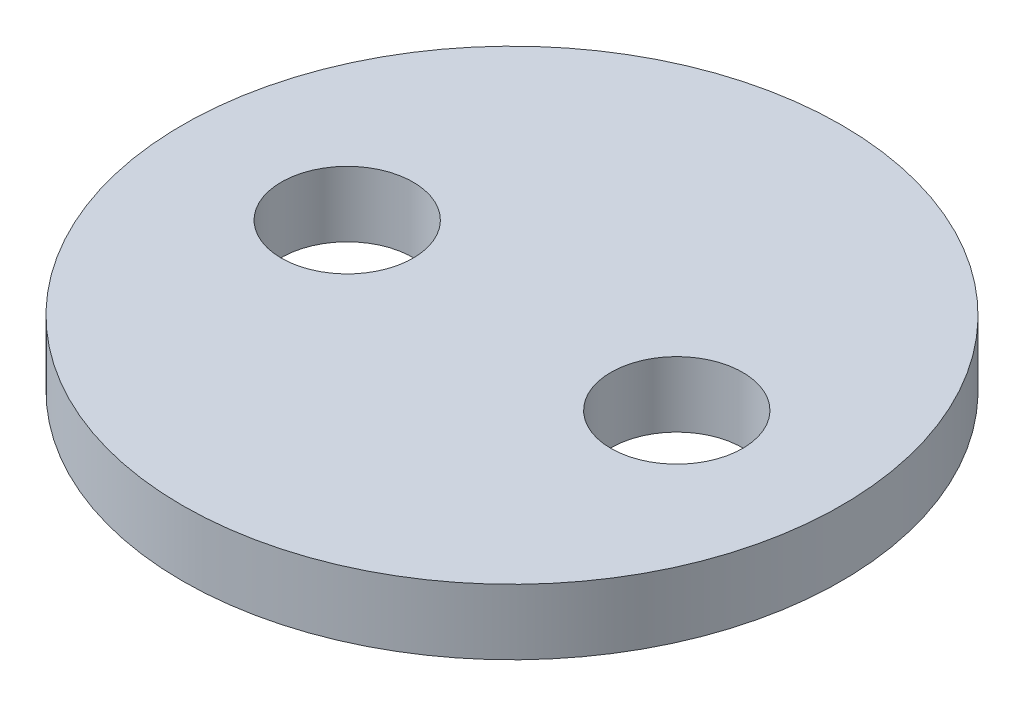
ISO-10303-21;
HEADER;
FILE_DESCRIPTION(('STEP AP214'),'2;1');
FILE_NAME('part.step','',(''),(''),'','','');
FILE_SCHEMA(('AUTOMOTIVE_DESIGN { 1 0 10303 214 1 1 1 1 }'));
ENDSEC;
DATA;
#1=APPLICATION_CONTEXT('core data for automotive mechanical design processes');
#2=APPLICATION_PROTOCOL_DEFINITION('international standard','automotive_design',2000,#1);
#3=PRODUCT_CONTEXT('',#1,'mechanical');
#4=PRODUCT('Part','Part','',(#3));
#5=PRODUCT_RELATED_PRODUCT_CATEGORY('part','',(#4));
#6=PRODUCT_DEFINITION_FORMATION('','',#4);
#7=PRODUCT_DEFINITION_CONTEXT('part definition',#1,'design');
#8=PRODUCT_DEFINITION('design','',#6,#7);
#9=PRODUCT_DEFINITION_SHAPE('','',#8);
#10=(LENGTH_UNIT() NAMED_UNIT(*) SI_UNIT(.MILLI.,.METRE.));
#11=(NAMED_UNIT(*) PLANE_ANGLE_UNIT() SI_UNIT($,.RADIAN.));
#12=(NAMED_UNIT(*) SI_UNIT($,.STERADIAN.) SOLID_ANGLE_UNIT());
#13=UNCERTAINTY_MEASURE_WITH_UNIT(LENGTH_MEASURE(1.E-05),#10,'distance_accuracy_value','');
#14=(GEOMETRIC_REPRESENTATION_CONTEXT(3) GLOBAL_UNCERTAINTY_ASSIGNED_CONTEXT((#13)) GLOBAL_UNIT_ASSIGNED_CONTEXT((#10,
#11,#12)) REPRESENTATION_CONTEXT('',''));
#15=CARTESIAN_POINT('',(0.,0.,0.));
#16=DIRECTION('',(0.,0.,1.));
#17=DIRECTION('',(1.,0.,0.));
#18=AXIS2_PLACEMENT_3D('',#15,#16,#17);
#19=CARTESIAN_POINT('',(0.,3.175,0.));
#20=DIRECTION('',(0.,1.,0.));
#21=DIRECTION('',(0.,0.,1.));
#22=AXIS2_PLACEMENT_3D('',#19,#20,#21);
#23=PLANE('',#22);
#24=CARTESIAN_POINT('',(8.,3.175,0.));
#25=DIRECTION('',(0.,1.,0.));
#26=DIRECTION('',(0.,0.,1.));
#27=AXIS2_PLACEMENT_3D('',#24,#25,#26);
#28=CIRCLE('',#27,3.2);
#29=CARTESIAN_POINT('',(8.,3.175,3.2));
#30=VERTEX_POINT('',#29);
#31=EDGE_CURVE('E42',#30,#30,#28,.T.);
#32=ORIENTED_EDGE('',*,*,#31,.F.);
#33=EDGE_LOOP('',(#32));
#34=FACE_BOUND('',#33,.T.);
#35=CARTESIAN_POINT('',(0.,3.175,0.));
#36=DIRECTION('',(0.,1.,0.));
#37=DIRECTION('',(0.,0.,1.));
#38=AXIS2_PLACEMENT_3D('',#35,#36,#37);
#39=CIRCLE('',#38,16.);
#40=CARTESIAN_POINT('',(0.,3.175,16.));
#41=VERTEX_POINT('',#40);
#42=EDGE_CURVE('E10',#41,#41,#39,.T.);
#43=ORIENTED_EDGE('',*,*,#42,.T.);
#44=EDGE_LOOP('',(#43));
#45=FACE_BOUND('',#44,.T.);
#46=CARTESIAN_POINT('',(-8.,3.175,0.));
#47=DIRECTION('',(0.,1.,0.));
#48=DIRECTION('',(0.,0.,1.));
#49=AXIS2_PLACEMENT_3D('',#46,#47,#48);
#50=CIRCLE('',#49,3.2);
#51=CARTESIAN_POINT('',(-8.,3.175,3.2));
#52=VERTEX_POINT('',#51);
#53=EDGE_CURVE('E47',#52,#52,#50,.T.);
#54=ORIENTED_EDGE('',*,*,#53,.F.);
#55=EDGE_LOOP('',(#54));
#56=FACE_BOUND('',#55,.T.);
#57=ADVANCED_FACE('F31',(#34,#45,#56),#23,.T.);
#58=CARTESIAN_POINT('',(0.,0.,0.));
#59=DIRECTION('',(0.,1.,0.));
#60=DIRECTION('',(0.,0.,1.));
#61=AXIS2_PLACEMENT_3D('',#58,#59,#60);
#62=PLANE('',#61);
#63=CARTESIAN_POINT('',(0.,0.,0.));
#64=DIRECTION('',(0.,1.,0.));
#65=DIRECTION('',(0.,0.,1.));
#66=AXIS2_PLACEMENT_3D('',#63,#64,#65);
#67=CIRCLE('',#66,16.);
#68=CARTESIAN_POINT('',(0.,0.,16.));
#69=VERTEX_POINT('',#68);
#70=EDGE_CURVE('E35',#69,#69,#67,.T.);
#71=ORIENTED_EDGE('',*,*,#70,.F.);
#72=EDGE_LOOP('',(#71));
#73=FACE_BOUND('',#72,.T.);
#74=CARTESIAN_POINT('',(8.,0.,0.));
#75=DIRECTION('',(0.,1.,0.));
#76=DIRECTION('',(0.,0.,1.));
#77=AXIS2_PLACEMENT_3D('',#74,#75,#76);
#78=CIRCLE('',#77,3.2);
#79=CARTESIAN_POINT('',(8.,0.,3.2));
#80=VERTEX_POINT('',#79);
#81=EDGE_CURVE('E44',#80,#80,#78,.T.);
#82=ORIENTED_EDGE('',*,*,#81,.T.);
#83=EDGE_LOOP('',(#82));
#84=FACE_BOUND('',#83,.T.);
#85=CARTESIAN_POINT('',(-8.,0.,0.));
#86=DIRECTION('',(0.,1.,0.));
#87=DIRECTION('',(0.,0.,1.));
#88=AXIS2_PLACEMENT_3D('',#85,#86,#87);
#89=CIRCLE('',#88,3.2);
#90=CARTESIAN_POINT('',(-8.,0.,3.2));
#91=VERTEX_POINT('',#90);
#92=EDGE_CURVE('E50',#91,#91,#89,.T.);
#93=ORIENTED_EDGE('',*,*,#92,.T.);
#94=EDGE_LOOP('',(#93));
#95=FACE_BOUND('',#94,.T.);
#96=ADVANCED_FACE('F60',(#73,#84,#95),#62,.F.);
#97=CARTESIAN_POINT('',(0.,3.175,0.));
#98=DIRECTION('',(0.,-1.,0.));
#99=DIRECTION('',(0.,0.,-1.));
#100=AXIS2_PLACEMENT_3D('',#97,#98,#99);
#101=CYLINDRICAL_SURFACE('',#100,16.);
#102=ORIENTED_EDGE('',*,*,#42,.F.);
#103=EDGE_LOOP('',(#102));
#104=FACE_BOUND('',#103,.T.);
#105=ORIENTED_EDGE('',*,*,#70,.T.);
#106=EDGE_LOOP('',(#105));
#107=FACE_BOUND('',#106,.T.);
#108=ADVANCED_FACE('F33',(#104,#107),#101,.T.);
#109=CARTESIAN_POINT('',(8.,3.175,0.));
#110=DIRECTION('',(0.,-1.,0.));
#111=DIRECTION('',(0.,0.,-1.));
#112=AXIS2_PLACEMENT_3D('',#109,#110,#111);
#113=CYLINDRICAL_SURFACE('',#112,3.2);
#114=ORIENTED_EDGE('',*,*,#31,.T.);
#115=EDGE_LOOP('',(#114));
#116=FACE_BOUND('',#115,.T.);
#117=ORIENTED_EDGE('',*,*,#81,.F.);
#118=EDGE_LOOP('',(#117));
#119=FACE_BOUND('',#118,.T.);
#120=ADVANCED_FACE('F69',(#116,#119),#113,.F.);
#121=CARTESIAN_POINT('',(-8.,3.175,0.));
#122=DIRECTION('',(0.,-1.,0.));
#123=DIRECTION('',(0.,0.,-1.));
#124=AXIS2_PLACEMENT_3D('',#121,#122,#123);
#125=CYLINDRICAL_SURFACE('',#124,3.2);
#126=ORIENTED_EDGE('',*,*,#53,.T.);
#127=EDGE_LOOP('',(#126));
#128=FACE_BOUND('',#127,.T.);
#129=ORIENTED_EDGE('',*,*,#92,.F.);
#130=EDGE_LOOP('',(#129));
#131=FACE_BOUND('',#130,.T.);
#132=ADVANCED_FACE('F56',(#128,#131),#125,.F.);
#133=CLOSED_SHELL('',(#57,#96,#108,#120,#132));
#134=MANIFOLD_SOLID_BREP('B2',#133);
#135=ADVANCED_BREP_SHAPE_REPRESENTATION('',(#18,#134),#14);
#136=SHAPE_DEFINITION_REPRESENTATION(#9,#135);
ENDSEC;
END-ISO-10303-21;
